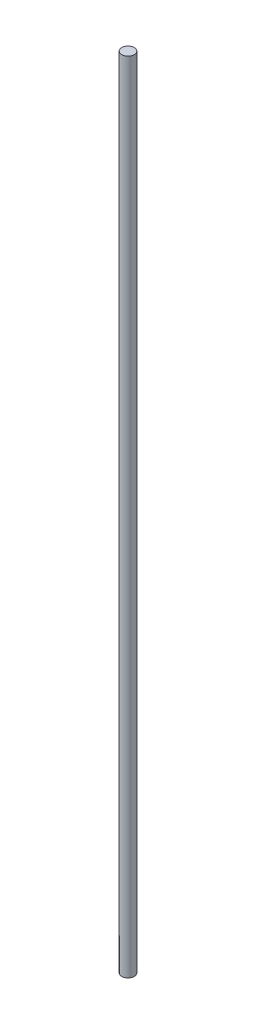
ISO-10303-21;
HEADER;
FILE_DESCRIPTION(('STEP AP214'),'2;1');
FILE_NAME('part.step','',(''),(''),'','','');
FILE_SCHEMA(('AUTOMOTIVE_DESIGN { 1 0 10303 214 1 1 1 1 }'));
ENDSEC;
DATA;
#1=APPLICATION_CONTEXT('core data for automotive mechanical design processes');
#2=APPLICATION_PROTOCOL_DEFINITION('international standard','automotive_design',2000,#1);
#3=PRODUCT_CONTEXT('',#1,'mechanical');
#4=PRODUCT('Part','Part','',(#3));
#5=PRODUCT_RELATED_PRODUCT_CATEGORY('part','',(#4));
#6=PRODUCT_DEFINITION_FORMATION('','',#4);
#7=PRODUCT_DEFINITION_CONTEXT('part definition',#1,'design');
#8=PRODUCT_DEFINITION('design','',#6,#7);
#9=PRODUCT_DEFINITION_SHAPE('','',#8);
#10=(LENGTH_UNIT() NAMED_UNIT(*) SI_UNIT(.MILLI.,.METRE.));
#11=(NAMED_UNIT(*) PLANE_ANGLE_UNIT() SI_UNIT($,.RADIAN.));
#12=(NAMED_UNIT(*) SI_UNIT($,.STERADIAN.) SOLID_ANGLE_UNIT());
#13=UNCERTAINTY_MEASURE_WITH_UNIT(LENGTH_MEASURE(1.E-05),#10,'distance_accuracy_value','');
#14=(GEOMETRIC_REPRESENTATION_CONTEXT(3) GLOBAL_UNCERTAINTY_ASSIGNED_CONTEXT((#13)) GLOBAL_UNIT_ASSIGNED_CONTEXT((#10,
#11,#12)) REPRESENTATION_CONTEXT('',''));
#15=CARTESIAN_POINT('',(0.,0.,0.));
#16=DIRECTION('',(0.,0.,1.));
#17=DIRECTION('',(1.,0.,0.));
#18=AXIS2_PLACEMENT_3D('',#15,#16,#17);
#19=CARTESIAN_POINT('',(0.,609.6,0.));
#20=DIRECTION('',(0.,-1.,0.));
#21=DIRECTION('',(0.,0.,-1.));
#22=AXIS2_PLACEMENT_3D('',#19,#20,#21);
#23=CYLINDRICAL_SURFACE('',#22,4.7625);
#24=CARTESIAN_POINT('',(0.,609.6,0.));
#25=DIRECTION('',(0.,1.,0.));
#26=DIRECTION('',(0.,0.,1.));
#27=AXIS2_PLACEMENT_3D('',#24,#25,#26);
#28=CIRCLE('',#27,4.7625);
#29=CARTESIAN_POINT('',(0.,609.6,-4.7625));
#30=VERTEX_POINT('',#29);
#31=EDGE_CURVE('E10',#30,#30,#28,.T.);
#32=CARTESIAN_POINT('',(0.,0.,0.));
#33=DIRECTION('',(0.,1.,0.));
#34=DIRECTION('',(0.,0.,1.));
#35=AXIS2_PLACEMENT_3D('',#32,#33,#34);
#36=CIRCLE('',#35,4.7625);
#37=CARTESIAN_POINT('',(0.,0.,-4.7625));
#38=VERTEX_POINT('',#37);
#39=EDGE_CURVE('E38',#38,#38,#36,.T.);
#40=CARTESIAN_POINT('',(0.,609.6,-4.7625));
#41=CARTESIAN_POINT('',(0.,603.25,-4.7625));
#42=CARTESIAN_POINT('',(0.,596.9,-4.7625));
#43=CARTESIAN_POINT('',(0.,584.2,-4.7625));
#44=CARTESIAN_POINT('',(0.,577.85,-4.7625));
#45=CARTESIAN_POINT('',(0.,565.15,-4.7625));
#46=CARTESIAN_POINT('',(0.,558.8,-4.7625));
#47=CARTESIAN_POINT('',(0.,546.1,-4.7625));
#48=CARTESIAN_POINT('',(0.,539.75,-4.7625));
#49=CARTESIAN_POINT('',(0.,527.05,-4.7625));
#50=CARTESIAN_POINT('',(0.,520.7,-4.7625));
#51=CARTESIAN_POINT('',(0.,508.,-4.7625));
#52=CARTESIAN_POINT('',(0.,501.65,-4.7625));
#53=CARTESIAN_POINT('',(0.,488.95,-4.7625));
#54=CARTESIAN_POINT('',(0.,482.6,-4.7625));
#55=CARTESIAN_POINT('',(0.,469.9,-4.7625));
#56=CARTESIAN_POINT('',(0.,463.55,-4.7625));
#57=CARTESIAN_POINT('',(0.,450.85,-4.7625));
#58=CARTESIAN_POINT('',(0.,444.5,-4.7625));
#59=CARTESIAN_POINT('',(0.,431.8,-4.7625));
#60=CARTESIAN_POINT('',(0.,425.45,-4.7625));
#61=CARTESIAN_POINT('',(0.,412.75,-4.7625));
#62=CARTESIAN_POINT('',(0.,406.4,-4.7625));
#63=CARTESIAN_POINT('',(0.,393.7,-4.7625));
#64=CARTESIAN_POINT('',(0.,387.35,-4.7625));
#65=CARTESIAN_POINT('',(0.,374.65,-4.7625));
#66=CARTESIAN_POINT('',(0.,368.3,-4.7625));
#67=CARTESIAN_POINT('',(0.,355.6,-4.7625));
#68=CARTESIAN_POINT('',(0.,349.25,-4.7625));
#69=CARTESIAN_POINT('',(0.,336.55,-4.7625));
#70=CARTESIAN_POINT('',(0.,330.2,-4.7625));
#71=CARTESIAN_POINT('',(0.,317.5,-4.7625));
#72=CARTESIAN_POINT('',(0.,311.15,-4.7625));
#73=CARTESIAN_POINT('',(0.,298.45,-4.7625));
#74=CARTESIAN_POINT('',(0.,292.1,-4.7625));
#75=CARTESIAN_POINT('',(0.,279.4,-4.7625));
#76=CARTESIAN_POINT('',(0.,273.05,-4.7625));
#77=CARTESIAN_POINT('',(0.,260.35,-4.7625));
#78=CARTESIAN_POINT('',(0.,254.,-4.7625));
#79=CARTESIAN_POINT('',(0.,241.3,-4.7625));
#80=CARTESIAN_POINT('',(0.,234.95,-4.7625));
#81=CARTESIAN_POINT('',(0.,222.25,-4.7625));
#82=CARTESIAN_POINT('',(0.,215.9,-4.7625));
#83=CARTESIAN_POINT('',(0.,203.2,-4.7625));
#84=CARTESIAN_POINT('',(0.,196.85,-4.7625));
#85=CARTESIAN_POINT('',(0.,184.15,-4.7625));
#86=CARTESIAN_POINT('',(0.,177.8,-4.7625));
#87=CARTESIAN_POINT('',(0.,165.1,-4.7625));
#88=CARTESIAN_POINT('',(0.,158.75,-4.7625));
#89=CARTESIAN_POINT('',(0.,146.05,-4.7625));
#90=CARTESIAN_POINT('',(0.,139.7,-4.7625));
#91=CARTESIAN_POINT('',(0.,127.,-4.7625));
#92=CARTESIAN_POINT('',(0.,120.65,-4.7625));
#93=CARTESIAN_POINT('',(0.,107.95,-4.7625));
#94=CARTESIAN_POINT('',(0.,101.6,-4.7625));
#95=CARTESIAN_POINT('',(0.,88.9,-4.7625));
#96=CARTESIAN_POINT('',(0.,82.5500000000001,-4.7625));
#97=CARTESIAN_POINT('',(0.,69.85,-4.7625));
#98=CARTESIAN_POINT('',(0.,63.5,-4.7625));
#99=CARTESIAN_POINT('',(0.,50.8,-4.7625));
#100=CARTESIAN_POINT('',(0.,44.45,-4.7625));
#101=CARTESIAN_POINT('',(0.,31.75,-4.7625));
#102=CARTESIAN_POINT('',(0.,25.4,-4.7625));
#103=CARTESIAN_POINT('',(0.,12.7,-4.7625));
#104=CARTESIAN_POINT('',(0.,6.35000000000001,-4.7625));
#105=CARTESIAN_POINT('',(0.,0.,-4.7625));
#106=B_SPLINE_CURVE_WITH_KNOTS('',3,(#40,#41,#42,#43,#44,#45,#46,#47,#48,#49,#50,#51,#52,#53,
#54,#55,#56,#57,#58,#59,#60,#61,#62,#63,#64,#65,#66,#67,#68,#69,#70,#71,#72,#73,#74,#75,#76,#77,
#78,#79,#80,#81,#82,#83,#84,#85,#86,#87,#88,#89,#90,#91,#92,#93,#94,#95,#96,#97,#98,#99,#100,
#101,#102,#103,#104,#105),.UNSPECIFIED.,.F.,.F.,(4,2,2,2,2,2,2,2,2,2,2,2,2,2,2,2,2,2,2,2,2,2,2,
2,2,2,2,2,2,2,2,2,4),(0.,19.0499999999999,38.0999999999999,57.1499999999999,76.1999999999999,
95.2499999999999,114.3,133.35,152.4,171.45,190.5,209.55,228.6,247.65,266.7,285.75,304.8,323.85,
342.9,361.95,381.,400.05,419.1,438.15,457.2,476.25,495.3,514.35,533.4,552.45,571.5,590.55,
609.6),.UNSPECIFIED.);
#107=EDGE_CURVE('BSEAM35',#30,#38,#106,.T.);
#108=ORIENTED_EDGE('',*,*,#31,.F.);
#109=ORIENTED_EDGE('',*,*,#39,.T.);
#110=ORIENTED_EDGE('',*,*,#107,.T.);
#111=ORIENTED_EDGE('',*,*,#107,.F.);
#112=EDGE_LOOP('',(#108,#110,#109,#111));
#113=FACE_BOUND('',#112,.T.);
#114=ADVANCED_FACE('F35',(#113),#23,.T.);
#115=CARTESIAN_POINT('',(0.,609.6,0.));
#116=DIRECTION('',(0.,1.,0.));
#117=DIRECTION('',(0.,0.,1.));
#118=AXIS2_PLACEMENT_3D('',#115,#116,#117);
#119=PLANE('',#118);
#120=ORIENTED_EDGE('',*,*,#31,.T.);
#121=EDGE_LOOP('',(#120));
#122=FACE_BOUND('',#121,.T.);
#123=ADVANCED_FACE('F52',(#122),#119,.T.);
#124=CARTESIAN_POINT('',(0.,0.,0.));
#125=DIRECTION('',(0.,1.,0.));
#126=DIRECTION('',(0.,0.,1.));
#127=AXIS2_PLACEMENT_3D('',#124,#125,#126);
#128=PLANE('',#127);
#129=ORIENTED_EDGE('',*,*,#39,.F.);
#130=EDGE_LOOP('',(#129));
#131=FACE_BOUND('',#130,.T.);
#132=ADVANCED_FACE('F50',(#131),#128,.F.);
#133=CLOSED_SHELL('',(#114,#123,#132));
#134=MANIFOLD_SOLID_BREP('B2',#133);
#135=ADVANCED_BREP_SHAPE_REPRESENTATION('',(#18,#134),#14);
#136=SHAPE_DEFINITION_REPRESENTATION(#9,#135);
ENDSEC;
END-ISO-10303-21;
